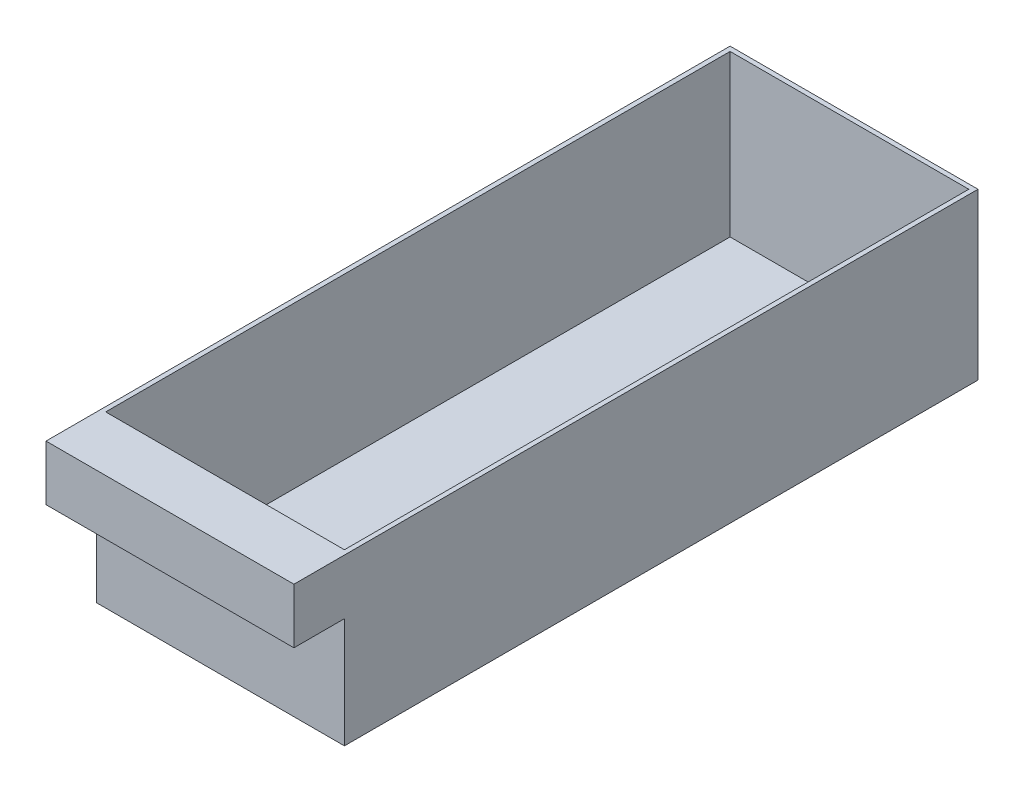
ISO-10303-21;
HEADER;
FILE_DESCRIPTION(('STEP AP214'),'2;1');
FILE_NAME('part.step','',(''),(''),'','','');
FILE_SCHEMA(('AUTOMOTIVE_DESIGN { 1 0 10303 214 1 1 1 1 }'));
ENDSEC;
DATA;
#1=APPLICATION_CONTEXT('core data for automotive mechanical design processes');
#2=APPLICATION_PROTOCOL_DEFINITION('international standard','automotive_design',2000,#1);
#3=PRODUCT_CONTEXT('',#1,'mechanical');
#4=PRODUCT('Part','Part','',(#3));
#5=PRODUCT_RELATED_PRODUCT_CATEGORY('part','',(#4));
#6=PRODUCT_DEFINITION_FORMATION('','',#4);
#7=PRODUCT_DEFINITION_CONTEXT('part definition',#1,'design');
#8=PRODUCT_DEFINITION('design','',#6,#7);
#9=PRODUCT_DEFINITION_SHAPE('','',#8);
#10=(LENGTH_UNIT() NAMED_UNIT(*) SI_UNIT(.MILLI.,.METRE.));
#11=(NAMED_UNIT(*) PLANE_ANGLE_UNIT() SI_UNIT($,.RADIAN.));
#12=(NAMED_UNIT(*) SI_UNIT($,.STERADIAN.) SOLID_ANGLE_UNIT());
#13=UNCERTAINTY_MEASURE_WITH_UNIT(LENGTH_MEASURE(1.E-05),#10,'distance_accuracy_value','');
#14=(GEOMETRIC_REPRESENTATION_CONTEXT(3) GLOBAL_UNCERTAINTY_ASSIGNED_CONTEXT((#13)) GLOBAL_UNIT_ASSIGNED_CONTEXT((#10,
#11,#12)) REPRESENTATION_CONTEXT('',''));
#15=CARTESIAN_POINT('',(0.,0.,0.));
#16=DIRECTION('',(0.,0.,1.));
#17=DIRECTION('',(1.,0.,0.));
#18=AXIS2_PLACEMENT_3D('',#15,#16,#17);
#19=CARTESIAN_POINT('',(-27.,36.,69.));
#20=DIRECTION('',(0.,0.,-1.));
#21=DIRECTION('',(-1.,0.,0.));
#22=AXIS2_PLACEMENT_3D('',#19,#20,#21);
#23=PLANE('',#22);
#24=DIRECTION('',(1.,0.,0.));
#25=VECTOR('',#24,1.);
#26=CARTESIAN_POINT('',(-27.,24.,69.));
#27=LINE('',#26,#25);
#28=CARTESIAN_POINT('',(-27.,24.,69.));
#29=VERTEX_POINT('',#28);
#30=CARTESIAN_POINT('',(-26.,24.,69.));
#31=VERTEX_POINT('',#30);
#32=EDGE_CURVE('E63',#29,#31,#27,.T.);
#33=ORIENTED_EDGE('',*,*,#32,.F.);
#34=DIRECTION('',(0.,-1.,0.));
#35=VECTOR('',#34,1.);
#36=CARTESIAN_POINT('',(-27.,36.,69.));
#37=LINE('',#36,#35);
#38=CARTESIAN_POINT('',(-27.,0.,69.));
#39=VERTEX_POINT('',#38);
#40=EDGE_CURVE('E229',#29,#39,#37,.T.);
#41=ORIENTED_EDGE('',*,*,#40,.T.);
#42=DIRECTION('',(1.,0.,0.));
#43=VECTOR('',#42,1.);
#44=CARTESIAN_POINT('',(-27.,0.,69.));
#45=LINE('',#44,#43);
#46=CARTESIAN_POINT('',(27.,0.,69.));
#47=VERTEX_POINT('',#46);
#48=EDGE_CURVE('E216',#39,#47,#45,.T.);
#49=ORIENTED_EDGE('',*,*,#48,.T.);
#50=DIRECTION('',(0.,-1.,0.));
#51=VECTOR('',#50,1.);
#52=CARTESIAN_POINT('',(27.,36.,69.));
#53=LINE('',#52,#51);
#54=CARTESIAN_POINT('',(27.,24.,69.));
#55=VERTEX_POINT('',#54);
#56=EDGE_CURVE('E165',#55,#47,#53,.T.);
#57=ORIENTED_EDGE('',*,*,#56,.F.);
#58=CARTESIAN_POINT('',(26.,24.,69.));
#59=VERTEX_POINT('',#58);
#60=EDGE_CURVE('E159',#59,#55,#27,.T.);
#61=ORIENTED_EDGE('',*,*,#60,.F.);
#62=DIRECTION('',(0.,-1.,0.));
#63=VECTOR('',#62,1.);
#64=CARTESIAN_POINT('',(26.,88.9528091794949,69.));
#65=LINE('',#64,#63);
#66=CARTESIAN_POINT('',(26.,35.,69.));
#67=VERTEX_POINT('',#66);
#68=EDGE_CURVE('E143',#67,#59,#65,.T.);
#69=ORIENTED_EDGE('',*,*,#68,.F.);
#70=DIRECTION('',(-1.,0.,0.));
#71=VECTOR('',#70,1.);
#72=CARTESIAN_POINT('',(-26.,35.,69.));
#73=LINE('',#72,#71);
#74=CARTESIAN_POINT('',(-26.,35.,69.));
#75=VERTEX_POINT('',#74);
#76=EDGE_CURVE('E167',#67,#75,#73,.T.);
#77=ORIENTED_EDGE('',*,*,#76,.T.);
#78=DIRECTION('',(0.,-1.,0.));
#79=VECTOR('',#78,1.);
#80=CARTESIAN_POINT('',(-26.,88.9528091794949,69.));
#81=LINE('',#80,#79);
#82=EDGE_CURVE('E154',#75,#31,#81,.T.);
#83=ORIENTED_EDGE('',*,*,#82,.T.);
#84=EDGE_LOOP('',(#33,#41,#49,#57,#61,#69,#77,#83));
#85=FACE_BOUND('',#84,.T.);
#86=ADVANCED_FACE('F41',(#85),#23,.F.);
#87=CARTESIAN_POINT('',(0.,36.,0.));
#88=DIRECTION('',(0.,-1.,0.));
#89=DIRECTION('',(0.,0.,-1.));
#90=AXIS2_PLACEMENT_3D('',#87,#88,#89);
#91=PLANE('',#90);
#92=DIRECTION('',(0.,0.,-1.));
#93=VECTOR('',#92,1.);
#94=CARTESIAN_POINT('',(27.,36.,69.));
#95=LINE('',#94,#93);
#96=CARTESIAN_POINT('',(27.,36.,80.));
#97=VERTEX_POINT('',#96);
#98=CARTESIAN_POINT('',(27.,36.,-69.));
#99=VERTEX_POINT('',#98);
#100=EDGE_CURVE('E212',#97,#99,#95,.T.);
#101=ORIENTED_EDGE('',*,*,#100,.T.);
#102=DIRECTION('',(-1.,0.,0.));
#103=VECTOR('',#102,1.);
#104=CARTESIAN_POINT('',(-27.,36.,-69.));
#105=LINE('',#104,#103);
#106=CARTESIAN_POINT('',(-27.,36.,-69.));
#107=VERTEX_POINT('',#106);
#108=EDGE_CURVE('E215',#99,#107,#105,.T.);
#109=ORIENTED_EDGE('',*,*,#108,.T.);
#110=DIRECTION('',(0.,0.,1.));
#111=VECTOR('',#110,1.);
#112=CARTESIAN_POINT('',(-27.,36.,69.));
#113=LINE('',#112,#111);
#114=CARTESIAN_POINT('',(-27.,36.,80.));
#115=VERTEX_POINT('',#114);
#116=EDGE_CURVE('E218',#107,#115,#113,.T.);
#117=ORIENTED_EDGE('',*,*,#116,.T.);
#118=DIRECTION('',(-1.,0.,0.));
#119=VECTOR('',#118,1.);
#120=CARTESIAN_POINT('',(-27.,36.,80.));
#121=LINE('',#120,#119);
#122=EDGE_CURVE('E174',#97,#115,#121,.T.);
#123=ORIENTED_EDGE('',*,*,#122,.F.);
#124=EDGE_LOOP('',(#101,#109,#117,#123));
#125=FACE_BOUND('',#124,.T.);
#126=DIRECTION('',(0.,0.,-1.));
#127=VECTOR('',#126,1.);
#128=CARTESIAN_POINT('',(26.,36.,0.));
#129=LINE('',#128,#127);
#130=CARTESIAN_POINT('',(26.,36.,68.));
#131=VERTEX_POINT('',#130);
#132=CARTESIAN_POINT('',(26.,36.,-68.));
#133=VERTEX_POINT('',#132);
#134=EDGE_CURVE('E204',#131,#133,#129,.T.);
#135=ORIENTED_EDGE('',*,*,#134,.F.);
#136=DIRECTION('',(1.,0.,0.));
#137=VECTOR('',#136,1.);
#138=CARTESIAN_POINT('',(0.,36.,68.));
#139=LINE('',#138,#137);
#140=CARTESIAN_POINT('',(-26.,36.,68.));
#141=VERTEX_POINT('',#140);
#142=EDGE_CURVE('E194',#141,#131,#139,.T.);
#143=ORIENTED_EDGE('',*,*,#142,.F.);
#144=DIRECTION('',(0.,0.,1.));
#145=VECTOR('',#144,1.);
#146=CARTESIAN_POINT('',(-26.,36.,0.));
#147=LINE('',#146,#145);
#148=CARTESIAN_POINT('',(-26.,36.,-68.));
#149=VERTEX_POINT('',#148);
#150=EDGE_CURVE('E208',#149,#141,#147,.T.);
#151=ORIENTED_EDGE('',*,*,#150,.F.);
#152=DIRECTION('',(-1.,0.,0.));
#153=VECTOR('',#152,1.);
#154=CARTESIAN_POINT('',(0.,36.,-68.));
#155=LINE('',#154,#153);
#156=EDGE_CURVE('E206',#133,#149,#155,.T.);
#157=ORIENTED_EDGE('',*,*,#156,.F.);
#158=EDGE_LOOP('',(#135,#143,#151,#157));
#159=FACE_BOUND('',#158,.T.);
#160=ADVANCED_FACE('F257',(#125,#159),#91,.F.);
#161=CARTESIAN_POINT('',(27.,36.,69.));
#162=DIRECTION('',(-1.,0.,0.));
#163=DIRECTION('',(0.,0.,1.));
#164=AXIS2_PLACEMENT_3D('',#161,#162,#163);
#165=PLANE('',#164);
#166=DIRECTION('',(0.,0.,-1.));
#167=VECTOR('',#166,1.);
#168=CARTESIAN_POINT('',(27.,0.,69.));
#169=LINE('',#168,#167);
#170=CARTESIAN_POINT('',(27.,0.,-69.));
#171=VERTEX_POINT('',#170);
#172=EDGE_CURVE('E188',#47,#171,#169,.T.);
#173=ORIENTED_EDGE('',*,*,#172,.T.);
#174=DIRECTION('',(0.,-1.,0.));
#175=VECTOR('',#174,1.);
#176=CARTESIAN_POINT('',(27.,36.,-69.));
#177=LINE('',#176,#175);
#178=EDGE_CURVE('E12',#99,#171,#177,.T.);
#179=ORIENTED_EDGE('',*,*,#178,.F.);
#180=ORIENTED_EDGE('',*,*,#100,.F.);
#181=DIRECTION('',(0.,1.,0.));
#182=VECTOR('',#181,1.);
#183=CARTESIAN_POINT('',(27.,36.,80.));
#184=LINE('',#183,#182);
#185=CARTESIAN_POINT('',(27.,24.,80.));
#186=VERTEX_POINT('',#185);
#187=EDGE_CURVE('E248',#186,#97,#184,.T.);
#188=ORIENTED_EDGE('',*,*,#187,.F.);
#189=DIRECTION('',(0.,0.,-1.));
#190=VECTOR('',#189,1.);
#191=CARTESIAN_POINT('',(27.,24.,80.));
#192=LINE('',#191,#190);
#193=EDGE_CURVE('E176',#186,#55,#192,.T.);
#194=ORIENTED_EDGE('',*,*,#193,.T.);
#195=ORIENTED_EDGE('',*,*,#56,.T.);
#196=EDGE_LOOP('',(#173,#179,#180,#188,#194,#195));
#197=FACE_BOUND('',#196,.T.);
#198=ADVANCED_FACE('F43',(#197),#165,.F.);
#199=CARTESIAN_POINT('',(-27.,36.,-69.));
#200=DIRECTION('',(0.,0.,1.));
#201=DIRECTION('',(1.,0.,0.));
#202=AXIS2_PLACEMENT_3D('',#199,#200,#201);
#203=PLANE('',#202);
#204=DIRECTION('',(-1.,0.,0.));
#205=VECTOR('',#204,1.);
#206=CARTESIAN_POINT('',(-27.,0.,-69.));
#207=LINE('',#206,#205);
#208=CARTESIAN_POINT('',(-27.,0.,-69.));
#209=VERTEX_POINT('',#208);
#210=EDGE_CURVE('E222',#171,#209,#207,.T.);
#211=ORIENTED_EDGE('',*,*,#210,.T.);
#212=DIRECTION('',(0.,-1.,0.));
#213=VECTOR('',#212,1.);
#214=CARTESIAN_POINT('',(-27.,36.,-69.));
#215=LINE('',#214,#213);
#216=EDGE_CURVE('E49',#107,#209,#215,.T.);
#217=ORIENTED_EDGE('',*,*,#216,.F.);
#218=ORIENTED_EDGE('',*,*,#108,.F.);
#219=ORIENTED_EDGE('',*,*,#178,.T.);
#220=EDGE_LOOP('',(#211,#217,#218,#219));
#221=FACE_BOUND('',#220,.T.);
#222=ADVANCED_FACE('F260',(#221),#203,.F.);
#223=CARTESIAN_POINT('',(-27.,36.,69.));
#224=DIRECTION('',(1.,0.,0.));
#225=DIRECTION('',(0.,0.,-1.));
#226=AXIS2_PLACEMENT_3D('',#223,#224,#225);
#227=PLANE('',#226);
#228=DIRECTION('',(0.,0.,1.));
#229=VECTOR('',#228,1.);
#230=CARTESIAN_POINT('',(-27.,0.,69.));
#231=LINE('',#230,#229);
#232=EDGE_CURVE('E224',#209,#39,#231,.T.);
#233=ORIENTED_EDGE('',*,*,#232,.T.);
#234=ORIENTED_EDGE('',*,*,#40,.F.);
#235=DIRECTION('',(0.,0.,-1.));
#236=VECTOR('',#235,1.);
#237=CARTESIAN_POINT('',(-27.,24.,80.));
#238=LINE('',#237,#236);
#239=CARTESIAN_POINT('',(-27.,24.,80.));
#240=VERTEX_POINT('',#239);
#241=EDGE_CURVE('E178',#240,#29,#238,.T.);
#242=ORIENTED_EDGE('',*,*,#241,.F.);
#243=DIRECTION('',(0.,-1.,0.));
#244=VECTOR('',#243,1.);
#245=CARTESIAN_POINT('',(-27.,36.,80.));
#246=LINE('',#245,#244);
#247=EDGE_CURVE('E169',#115,#240,#246,.T.);
#248=ORIENTED_EDGE('',*,*,#247,.F.);
#249=ORIENTED_EDGE('',*,*,#116,.F.);
#250=ORIENTED_EDGE('',*,*,#216,.T.);
#251=EDGE_LOOP('',(#233,#234,#242,#248,#249,#250));
#252=FACE_BOUND('',#251,.T.);
#253=ADVANCED_FACE('F235',(#252),#227,.F.);
#254=CARTESIAN_POINT('',(0.,0.,0.));
#255=DIRECTION('',(0.,-1.,0.));
#256=DIRECTION('',(0.,0.,-1.));
#257=AXIS2_PLACEMENT_3D('',#254,#255,#256);
#258=PLANE('',#257);
#259=ORIENTED_EDGE('',*,*,#172,.F.);
#260=ORIENTED_EDGE('',*,*,#48,.F.);
#261=ORIENTED_EDGE('',*,*,#232,.F.);
#262=ORIENTED_EDGE('',*,*,#210,.F.);
#263=EDGE_LOOP('',(#259,#260,#261,#262));
#264=FACE_BOUND('',#263,.T.);
#265=ADVANCED_FACE('F241',(#264),#258,.T.);
#266=CARTESIAN_POINT('',(26.,36.,69.));
#267=DIRECTION('',(-1.,0.,0.));
#268=DIRECTION('',(0.,0.,1.));
#269=AXIS2_PLACEMENT_3D('',#266,#267,#268);
#270=PLANE('',#269);
#271=DIRECTION('',(0.,0.,-1.));
#272=VECTOR('',#271,1.);
#273=CARTESIAN_POINT('',(26.,1.,0.));
#274=LINE('',#273,#272);
#275=CARTESIAN_POINT('',(26.,1.,68.));
#276=VERTEX_POINT('',#275);
#277=CARTESIAN_POINT('',(26.,1.,-68.));
#278=VERTEX_POINT('',#277);
#279=EDGE_CURVE('E181',#276,#278,#274,.T.);
#280=ORIENTED_EDGE('',*,*,#279,.F.);
#281=DIRECTION('',(0.,-1.,0.));
#282=VECTOR('',#281,1.);
#283=CARTESIAN_POINT('',(26.,36.,68.));
#284=LINE('',#283,#282);
#285=EDGE_CURVE('E190',#131,#276,#284,.T.);
#286=ORIENTED_EDGE('',*,*,#285,.F.);
#287=ORIENTED_EDGE('',*,*,#134,.T.);
#288=DIRECTION('',(0.,-1.,0.));
#289=VECTOR('',#288,1.);
#290=CARTESIAN_POINT('',(26.,36.,-68.));
#291=LINE('',#290,#289);
#292=EDGE_CURVE('E185',#133,#278,#291,.T.);
#293=ORIENTED_EDGE('',*,*,#292,.T.);
#294=EDGE_LOOP('',(#280,#286,#287,#293));
#295=FACE_BOUND('',#294,.T.);
#296=ADVANCED_FACE('F277',(#295),#270,.T.);
#297=CARTESIAN_POINT('',(-27.,36.,-68.));
#298=DIRECTION('',(0.,0.,1.));
#299=DIRECTION('',(1.,0.,0.));
#300=AXIS2_PLACEMENT_3D('',#297,#298,#299);
#301=PLANE('',#300);
#302=DIRECTION('',(-1.,0.,0.));
#303=VECTOR('',#302,1.);
#304=CARTESIAN_POINT('',(0.,1.,-68.));
#305=LINE('',#304,#303);
#306=CARTESIAN_POINT('',(-26.,1.,-68.));
#307=VERTEX_POINT('',#306);
#308=EDGE_CURVE('E184',#278,#307,#305,.T.);
#309=ORIENTED_EDGE('',*,*,#308,.F.);
#310=ORIENTED_EDGE('',*,*,#292,.F.);
#311=ORIENTED_EDGE('',*,*,#156,.T.);
#312=DIRECTION('',(0.,-1.,0.));
#313=VECTOR('',#312,1.);
#314=CARTESIAN_POINT('',(-26.,36.,-68.));
#315=LINE('',#314,#313);
#316=EDGE_CURVE('E189',#149,#307,#315,.T.);
#317=ORIENTED_EDGE('',*,*,#316,.T.);
#318=EDGE_LOOP('',(#309,#310,#311,#317));
#319=FACE_BOUND('',#318,.T.);
#320=ADVANCED_FACE('F281',(#319),#301,.T.);
#321=CARTESIAN_POINT('',(-26.,36.,69.));
#322=DIRECTION('',(1.,0.,0.));
#323=DIRECTION('',(0.,0.,-1.));
#324=AXIS2_PLACEMENT_3D('',#321,#322,#323);
#325=PLANE('',#324);
#326=DIRECTION('',(0.,0.,1.));
#327=VECTOR('',#326,1.);
#328=CARTESIAN_POINT('',(-26.,1.,0.));
#329=LINE('',#328,#327);
#330=CARTESIAN_POINT('',(-26.,1.,68.));
#331=VERTEX_POINT('',#330);
#332=EDGE_CURVE('E196',#307,#331,#329,.T.);
#333=ORIENTED_EDGE('',*,*,#332,.F.);
#334=ORIENTED_EDGE('',*,*,#316,.F.);
#335=ORIENTED_EDGE('',*,*,#150,.T.);
#336=DIRECTION('',(0.,-1.,0.));
#337=VECTOR('',#336,1.);
#338=CARTESIAN_POINT('',(-26.,36.,68.));
#339=LINE('',#338,#337);
#340=EDGE_CURVE('E193',#141,#331,#339,.T.);
#341=ORIENTED_EDGE('',*,*,#340,.T.);
#342=EDGE_LOOP('',(#333,#334,#335,#341));
#343=FACE_BOUND('',#342,.T.);
#344=ADVANCED_FACE('F287',(#343),#325,.T.);
#345=CARTESIAN_POINT('',(-27.,36.,68.));
#346=DIRECTION('',(0.,0.,-1.));
#347=DIRECTION('',(-1.,0.,0.));
#348=AXIS2_PLACEMENT_3D('',#345,#346,#347);
#349=PLANE('',#348);
#350=DIRECTION('',(1.,0.,0.));
#351=VECTOR('',#350,1.);
#352=CARTESIAN_POINT('',(0.,1.,68.));
#353=LINE('',#352,#351);
#354=EDGE_CURVE('E200',#331,#276,#353,.T.);
#355=ORIENTED_EDGE('',*,*,#354,.F.);
#356=ORIENTED_EDGE('',*,*,#340,.F.);
#357=ORIENTED_EDGE('',*,*,#142,.T.);
#358=ORIENTED_EDGE('',*,*,#285,.T.);
#359=EDGE_LOOP('',(#355,#356,#357,#358));
#360=FACE_BOUND('',#359,.T.);
#361=ADVANCED_FACE('F296',(#360),#349,.T.);
#362=CARTESIAN_POINT('',(0.,1.,0.));
#363=DIRECTION('',(0.,-1.,0.));
#364=DIRECTION('',(0.,0.,-1.));
#365=AXIS2_PLACEMENT_3D('',#362,#363,#364);
#366=PLANE('',#365);
#367=ORIENTED_EDGE('',*,*,#279,.T.);
#368=ORIENTED_EDGE('',*,*,#308,.T.);
#369=ORIENTED_EDGE('',*,*,#332,.T.);
#370=ORIENTED_EDGE('',*,*,#354,.T.);
#371=EDGE_LOOP('',(#367,#368,#369,#370));
#372=FACE_BOUND('',#371,.T.);
#373=ADVANCED_FACE('F300',(#372),#366,.F.);
#374=CARTESIAN_POINT('',(-27.,24.,80.));
#375=DIRECTION('',(0.,1.,0.));
#376=DIRECTION('',(0.,0.,1.));
#377=AXIS2_PLACEMENT_3D('',#374,#375,#376);
#378=PLANE('',#377);
#379=ORIENTED_EDGE('',*,*,#32,.T.);
#380=DIRECTION('',(0.,0.,-1.));
#381=VECTOR('',#380,1.);
#382=CARTESIAN_POINT('',(-26.,24.,79.));
#383=LINE('',#382,#381);
#384=CARTESIAN_POINT('',(-26.,24.,79.));
#385=VERTEX_POINT('',#384);
#386=EDGE_CURVE('E56',#385,#31,#383,.T.);
#387=ORIENTED_EDGE('',*,*,#386,.F.);
#388=DIRECTION('',(-1.,0.,0.));
#389=VECTOR('',#388,1.);
#390=CARTESIAN_POINT('',(-26.,24.,79.));
#391=LINE('',#390,#389);
#392=CARTESIAN_POINT('',(26.,24.,79.));
#393=VERTEX_POINT('',#392);
#394=EDGE_CURVE('E162',#393,#385,#391,.T.);
#395=ORIENTED_EDGE('',*,*,#394,.F.);
#396=DIRECTION('',(0.,0.,1.));
#397=VECTOR('',#396,1.);
#398=CARTESIAN_POINT('',(26.,24.,79.));
#399=LINE('',#398,#397);
#400=EDGE_CURVE('E147',#59,#393,#399,.T.);
#401=ORIENTED_EDGE('',*,*,#400,.F.);
#402=ORIENTED_EDGE('',*,*,#60,.T.);
#403=ORIENTED_EDGE('',*,*,#193,.F.);
#404=DIRECTION('',(1.,0.,0.));
#405=VECTOR('',#404,1.);
#406=CARTESIAN_POINT('',(-27.,24.,80.));
#407=LINE('',#406,#405);
#408=EDGE_CURVE('E243',#240,#186,#407,.T.);
#409=ORIENTED_EDGE('',*,*,#408,.F.);
#410=ORIENTED_EDGE('',*,*,#241,.T.);
#411=EDGE_LOOP('',(#379,#387,#395,#401,#402,#403,#409,#410));
#412=FACE_BOUND('',#411,.T.);
#413=ADVANCED_FACE('F157',(#412),#378,.F.);
#414=CARTESIAN_POINT('',(0.,0.,80.));
#415=DIRECTION('',(0.,0.,1.));
#416=DIRECTION('',(1.,0.,0.));
#417=AXIS2_PLACEMENT_3D('',#414,#415,#416);
#418=PLANE('',#417);
#419=ORIENTED_EDGE('',*,*,#247,.T.);
#420=ORIENTED_EDGE('',*,*,#408,.T.);
#421=ORIENTED_EDGE('',*,*,#187,.T.);
#422=ORIENTED_EDGE('',*,*,#122,.T.);
#423=EDGE_LOOP('',(#419,#420,#421,#422));
#424=FACE_BOUND('',#423,.T.);
#425=ADVANCED_FACE('F251',(#424),#418,.T.);
#426=CARTESIAN_POINT('',(-26.,88.9528091794949,79.));
#427=DIRECTION('',(-1.,0.,0.));
#428=DIRECTION('',(0.,0.,1.));
#429=AXIS2_PLACEMENT_3D('',#426,#427,#428);
#430=PLANE('',#429);
#431=DIRECTION('',(0.,0.,1.));
#432=VECTOR('',#431,1.);
#433=CARTESIAN_POINT('',(-26.,35.,79.));
#434=LINE('',#433,#432);
#435=CARTESIAN_POINT('',(-26.,35.,79.));
#436=VERTEX_POINT('',#435);
#437=EDGE_CURVE('E170',#75,#436,#434,.T.);
#438=ORIENTED_EDGE('',*,*,#437,.T.);
#439=DIRECTION('',(0.,-1.,0.));
#440=VECTOR('',#439,1.);
#441=CARTESIAN_POINT('',(-26.,88.9528091794949,79.));
#442=LINE('',#441,#440);
#443=EDGE_CURVE('E344',#436,#385,#442,.T.);
#444=ORIENTED_EDGE('',*,*,#443,.T.);
#445=ORIENTED_EDGE('',*,*,#386,.T.);
#446=ORIENTED_EDGE('',*,*,#82,.F.);
#447=EDGE_LOOP('',(#438,#444,#445,#446));
#448=FACE_BOUND('',#447,.T.);
#449=ADVANCED_FACE('F319',(#448),#430,.F.);
#450=CARTESIAN_POINT('',(-26.,88.9528091794949,79.));
#451=DIRECTION('',(0.,0.,1.));
#452=DIRECTION('',(1.,0.,0.));
#453=AXIS2_PLACEMENT_3D('',#450,#451,#452);
#454=PLANE('',#453);
#455=DIRECTION('',(1.,0.,0.));
#456=VECTOR('',#455,1.);
#457=CARTESIAN_POINT('',(-26.,35.,79.));
#458=LINE('',#457,#456);
#459=CARTESIAN_POINT('',(26.,35.,79.));
#460=VERTEX_POINT('',#459);
#461=EDGE_CURVE('E338',#436,#460,#458,.T.);
#462=ORIENTED_EDGE('',*,*,#461,.T.);
#463=DIRECTION('',(0.,-1.,0.));
#464=VECTOR('',#463,1.);
#465=CARTESIAN_POINT('',(26.,88.9528091794949,79.));
#466=LINE('',#465,#464);
#467=EDGE_CURVE('E153',#460,#393,#466,.T.);
#468=ORIENTED_EDGE('',*,*,#467,.T.);
#469=ORIENTED_EDGE('',*,*,#394,.T.);
#470=ORIENTED_EDGE('',*,*,#443,.F.);
#471=EDGE_LOOP('',(#462,#468,#469,#470));
#472=FACE_BOUND('',#471,.T.);
#473=ADVANCED_FACE('F323',(#472),#454,.F.);
#474=CARTESIAN_POINT('',(26.,88.9528091794949,79.));
#475=DIRECTION('',(1.,0.,0.));
#476=DIRECTION('',(0.,0.,-1.));
#477=AXIS2_PLACEMENT_3D('',#474,#475,#476);
#478=PLANE('',#477);
#479=DIRECTION('',(0.,0.,-1.));
#480=VECTOR('',#479,1.);
#481=CARTESIAN_POINT('',(26.,35.,79.));
#482=LINE('',#481,#480);
#483=EDGE_CURVE('E150',#460,#67,#482,.T.);
#484=ORIENTED_EDGE('',*,*,#483,.T.);
#485=ORIENTED_EDGE('',*,*,#68,.T.);
#486=ORIENTED_EDGE('',*,*,#400,.T.);
#487=ORIENTED_EDGE('',*,*,#467,.F.);
#488=EDGE_LOOP('',(#484,#485,#486,#487));
#489=FACE_BOUND('',#488,.T.);
#490=ADVANCED_FACE('F145',(#489),#478,.F.);
#491=CARTESIAN_POINT('',(0.,35.,0.));
#492=DIRECTION('',(0.,-1.,0.));
#493=DIRECTION('',(0.,0.,-1.));
#494=AXIS2_PLACEMENT_3D('',#491,#492,#493);
#495=PLANE('',#494);
#496=ORIENTED_EDGE('',*,*,#437,.F.);
#497=ORIENTED_EDGE('',*,*,#76,.F.);
#498=ORIENTED_EDGE('',*,*,#483,.F.);
#499=ORIENTED_EDGE('',*,*,#461,.F.);
#500=EDGE_LOOP('',(#496,#497,#498,#499));
#501=FACE_BOUND('',#500,.T.);
#502=ADVANCED_FACE('F328',(#501),#495,.T.);
#503=CLOSED_SHELL('',(#86,#160,#198,#222,#253,#265,#296,#320,#344,#361,#373,#413,#425,#449,#473,
#490,#502));
#504=MANIFOLD_SOLID_BREP('B2',#503);
#505=ADVANCED_BREP_SHAPE_REPRESENTATION('',(#18,#504),#14);
#506=SHAPE_DEFINITION_REPRESENTATION(#9,#505);
ENDSEC;
END-ISO-10303-21;
